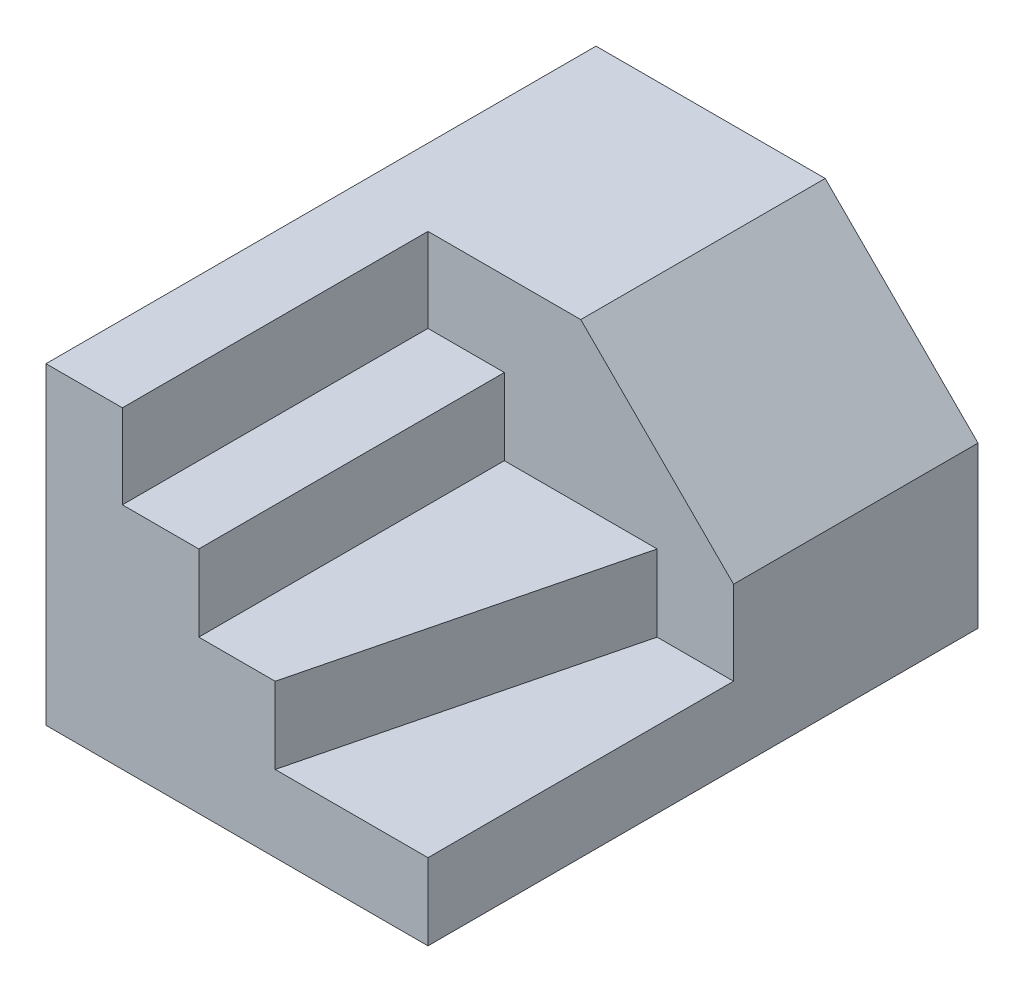
ISO-10303-21;
HEADER;
FILE_DESCRIPTION(('STEP AP214'),'2;1');
FILE_NAME('part.step','',(''),(''),'','','');
FILE_SCHEMA(('AUTOMOTIVE_DESIGN { 1 0 10303 214 1 1 1 1 }'));
ENDSEC;
DATA;
#1=APPLICATION_CONTEXT('core data for automotive mechanical design processes');
#2=APPLICATION_PROTOCOL_DEFINITION('international standard','automotive_design',2000,#1);
#3=PRODUCT_CONTEXT('',#1,'mechanical');
#4=PRODUCT('Part','Part','',(#3));
#5=PRODUCT_RELATED_PRODUCT_CATEGORY('part','',(#4));
#6=PRODUCT_DEFINITION_FORMATION('','',#4);
#7=PRODUCT_DEFINITION_CONTEXT('part definition',#1,'design');
#8=PRODUCT_DEFINITION('design','',#6,#7);
#9=PRODUCT_DEFINITION_SHAPE('','',#8);
#10=(LENGTH_UNIT() NAMED_UNIT(*) SI_UNIT(.MILLI.,.METRE.));
#11=(NAMED_UNIT(*) PLANE_ANGLE_UNIT() SI_UNIT($,.RADIAN.));
#12=(NAMED_UNIT(*) SI_UNIT($,.STERADIAN.) SOLID_ANGLE_UNIT());
#13=UNCERTAINTY_MEASURE_WITH_UNIT(LENGTH_MEASURE(1.E-05),#10,'distance_accuracy_value','');
#14=(GEOMETRIC_REPRESENTATION_CONTEXT(3) GLOBAL_UNCERTAINTY_ASSIGNED_CONTEXT((#13)) GLOBAL_UNIT_ASSIGNED_CONTEXT((#10,
#11,#12)) REPRESENTATION_CONTEXT('',''));
#15=CARTESIAN_POINT('',(0.,0.,0.));
#16=DIRECTION('',(0.,0.,1.));
#17=DIRECTION('',(1.,0.,0.));
#18=AXIS2_PLACEMENT_3D('',#15,#16,#17);
#19=CARTESIAN_POINT('',(0.,254.,0.));
#20=DIRECTION('',(0.,-1.,0.));
#21=DIRECTION('',(0.,0.,-1.));
#22=AXIS2_PLACEMENT_3D('',#19,#20,#21);
#23=PLANE('',#22);
#24=DIRECTION('',(0.242535625036333,0.,-0.970142500145332));
#25=VECTOR('',#24,1.);
#26=CARTESIAN_POINT('',(1016.,254.,-1016.));
#27=LINE('',#26,#25);
#28=CARTESIAN_POINT('',(762.,254.,0.));
#29=VERTEX_POINT('',#28);
#30=CARTESIAN_POINT('',(1016.,254.,-1016.));
#31=VERTEX_POINT('',#30);
#32=EDGE_CURVE('E149',#29,#31,#27,.T.);
#33=ORIENTED_EDGE('',*,*,#32,.F.);
#34=DIRECTION('',(1.,0.,0.));
#35=VECTOR('',#34,1.);
#36=CARTESIAN_POINT('',(0.,254.,0.));
#37=LINE('',#36,#35);
#38=CARTESIAN_POINT('',(1270.,254.,0.));
#39=VERTEX_POINT('',#38);
#40=EDGE_CURVE('E202',#29,#39,#37,.T.);
#41=ORIENTED_EDGE('',*,*,#40,.T.);
#42=DIRECTION('',(0.,0.,-1.));
#43=VECTOR('',#42,1.);
#44=CARTESIAN_POINT('',(1270.,254.,0.));
#45=LINE('',#44,#43);
#46=CARTESIAN_POINT('',(1270.,254.,-1016.));
#47=VERTEX_POINT('',#46);
#48=EDGE_CURVE('E204',#39,#47,#45,.T.);
#49=ORIENTED_EDGE('',*,*,#48,.T.);
#50=DIRECTION('',(-1.,0.,0.));
#51=VECTOR('',#50,1.);
#52=CARTESIAN_POINT('',(0.,254.,-1016.));
#53=LINE('',#52,#51);
#54=EDGE_CURVE('E178',#47,#31,#53,.T.);
#55=ORIENTED_EDGE('',*,*,#54,.T.);
#56=EDGE_LOOP('',(#33,#41,#49,#55));
#57=FACE_BOUND('',#56,.T.);
#58=ADVANCED_FACE('F37',(#57),#23,.F.);
#59=CARTESIAN_POINT('',(0.,0.,-1016.));
#60=DIRECTION('',(0.,0.,1.));
#61=DIRECTION('',(1.,0.,0.));
#62=AXIS2_PLACEMENT_3D('',#59,#60,#61);
#63=PLANE('',#62);
#64=DIRECTION('',(-1.,0.,0.));
#65=VECTOR('',#64,1.);
#66=CARTESIAN_POINT('',(508.,508.,-1016.));
#67=LINE('',#66,#65);
#68=CARTESIAN_POINT('',(1016.,508.,-1016.));
#69=VERTEX_POINT('',#68);
#70=CARTESIAN_POINT('',(508.,508.,-1016.));
#71=VERTEX_POINT('',#70);
#72=EDGE_CURVE('E52',#69,#71,#67,.T.);
#73=ORIENTED_EDGE('',*,*,#72,.F.);
#74=DIRECTION('',(0.,-1.,0.));
#75=VECTOR('',#74,1.);
#76=CARTESIAN_POINT('',(1016.,508.,-1016.));
#77=LINE('',#76,#75);
#78=EDGE_CURVE('E57',#69,#31,#77,.T.);
#79=ORIENTED_EDGE('',*,*,#78,.T.);
#80=ORIENTED_EDGE('',*,*,#54,.F.);
#81=DIRECTION('',(0.,-1.,0.));
#82=VECTOR('',#81,1.);
#83=CARTESIAN_POINT('',(1270.,254.,-1016.));
#84=LINE('',#83,#82);
#85=CARTESIAN_POINT('',(1270.,533.399999999998,-1016.));
#86=VERTEX_POINT('',#85);
#87=EDGE_CURVE('E186',#86,#47,#84,.T.);
#88=ORIENTED_EDGE('',*,*,#87,.F.);
#89=DIRECTION('',(0.707106781186546,-0.707106781186549,0.));
#90=VECTOR('',#89,1.);
#91=CARTESIAN_POINT('',(1270.,533.399999999998,-1016.));
#92=LINE('',#91,#90);
#93=CARTESIAN_POINT('',(762.,1041.4,-1016.));
#94=VERTEX_POINT('',#93);
#95=EDGE_CURVE('E183',#94,#86,#92,.T.);
#96=ORIENTED_EDGE('',*,*,#95,.F.);
#97=DIRECTION('',(1.,0.,0.));
#98=VECTOR('',#97,1.);
#99=CARTESIAN_POINT('',(762.,1041.4,-1016.));
#100=LINE('',#99,#98);
#101=CARTESIAN_POINT('',(254.,1041.4,-1016.));
#102=VERTEX_POINT('',#101);
#103=EDGE_CURVE('E180',#102,#94,#100,.T.);
#104=ORIENTED_EDGE('',*,*,#103,.F.);
#105=DIRECTION('',(0.,-1.,0.));
#106=VECTOR('',#105,1.);
#107=CARTESIAN_POINT('',(254.,1041.4,-1016.));
#108=LINE('',#107,#106);
#109=CARTESIAN_POINT('',(254.,762.,-1016.));
#110=VERTEX_POINT('',#109);
#111=EDGE_CURVE('E172',#102,#110,#108,.T.);
#112=ORIENTED_EDGE('',*,*,#111,.T.);
#113=DIRECTION('',(-1.,0.,0.));
#114=VECTOR('',#113,1.);
#115=CARTESIAN_POINT('',(508.,762.,-1016.));
#116=LINE('',#115,#114);
#117=CARTESIAN_POINT('',(508.,762.,-1016.));
#118=VERTEX_POINT('',#117);
#119=EDGE_CURVE('E164',#118,#110,#116,.T.);
#120=ORIENTED_EDGE('',*,*,#119,.F.);
#121=DIRECTION('',(0.,1.,0.));
#122=VECTOR('',#121,1.);
#123=CARTESIAN_POINT('',(508.,254.,-1016.));
#124=LINE('',#123,#122);
#125=EDGE_CURVE('E135',#71,#118,#124,.T.);
#126=ORIENTED_EDGE('',*,*,#125,.F.);
#127=EDGE_LOOP('',(#73,#79,#80,#88,#96,#104,#112,#120,#126));
#128=FACE_BOUND('',#127,.T.);
#129=ADVANCED_FACE('F259',(#128),#63,.T.);
#130=CARTESIAN_POINT('',(508.,0.,0.));
#131=DIRECTION('',(-1.,0.,0.));
#132=DIRECTION('',(0.,0.,1.));
#133=AXIS2_PLACEMENT_3D('',#130,#131,#132);
#134=PLANE('',#133);
#135=DIRECTION('',(0.,0.,1.));
#136=VECTOR('',#135,1.);
#137=CARTESIAN_POINT('',(508.,508.,0.));
#138=LINE('',#137,#136);
#139=CARTESIAN_POINT('',(508.,508.,0.));
#140=VERTEX_POINT('',#139);
#141=EDGE_CURVE('E129',#71,#140,#138,.T.);
#142=ORIENTED_EDGE('',*,*,#141,.F.);
#143=ORIENTED_EDGE('',*,*,#125,.T.);
#144=DIRECTION('',(0.,0.,1.));
#145=VECTOR('',#144,1.);
#146=CARTESIAN_POINT('',(508.,762.,0.));
#147=LINE('',#146,#145);
#148=CARTESIAN_POINT('',(508.,762.,0.));
#149=VERTEX_POINT('',#148);
#150=EDGE_CURVE('E131',#118,#149,#147,.T.);
#151=ORIENTED_EDGE('',*,*,#150,.T.);
#152=DIRECTION('',(0.,-1.,0.));
#153=VECTOR('',#152,1.);
#154=CARTESIAN_POINT('',(508.,254.,0.));
#155=LINE('',#154,#153);
#156=EDGE_CURVE('E125',#149,#140,#155,.T.);
#157=ORIENTED_EDGE('',*,*,#156,.T.);
#158=EDGE_LOOP('',(#142,#143,#151,#157));
#159=FACE_BOUND('',#158,.T.);
#160=ADVANCED_FACE('F127',(#159),#134,.F.);
#161=CARTESIAN_POINT('',(254.,1041.4,0.));
#162=DIRECTION('',(-1.,0.,0.));
#163=DIRECTION('',(0.,0.,1.));
#164=AXIS2_PLACEMENT_3D('',#161,#162,#163);
#165=PLANE('',#164);
#166=DIRECTION('',(0.,0.,1.));
#167=VECTOR('',#166,1.);
#168=CARTESIAN_POINT('',(254.,762.,0.));
#169=LINE('',#168,#167);
#170=CARTESIAN_POINT('',(254.,762.,0.));
#171=VERTEX_POINT('',#170);
#172=EDGE_CURVE('E136',#110,#171,#169,.T.);
#173=ORIENTED_EDGE('',*,*,#172,.F.);
#174=ORIENTED_EDGE('',*,*,#111,.F.);
#175=DIRECTION('',(0.,0.,-1.));
#176=VECTOR('',#175,1.);
#177=CARTESIAN_POINT('',(254.,1041.4,0.));
#178=LINE('',#177,#176);
#179=CARTESIAN_POINT('',(254.,1041.4,0.));
#180=VERTEX_POINT('',#179);
#181=EDGE_CURVE('E169',#180,#102,#178,.T.);
#182=ORIENTED_EDGE('',*,*,#181,.F.);
#183=DIRECTION('',(0.,-1.,0.));
#184=VECTOR('',#183,1.);
#185=CARTESIAN_POINT('',(254.,1041.4,0.));
#186=LINE('',#185,#184);
#187=EDGE_CURVE('E175',#180,#171,#186,.T.);
#188=ORIENTED_EDGE('',*,*,#187,.T.);
#189=EDGE_LOOP('',(#173,#174,#182,#188));
#190=FACE_BOUND('',#189,.T.);
#191=ADVANCED_FACE('F279',(#190),#165,.F.);
#192=CARTESIAN_POINT('',(0.,254.,0.));
#193=DIRECTION('',(1.,0.,0.));
#194=DIRECTION('',(0.,0.,-1.));
#195=AXIS2_PLACEMENT_3D('',#192,#193,#194);
#196=PLANE('',#195);
#197=DIRECTION('',(0.,-1.,0.));
#198=VECTOR('',#197,1.);
#199=CARTESIAN_POINT('',(0.,254.,0.));
#200=LINE('',#199,#198);
#201=CARTESIAN_POINT('',(0.,1041.4,0.));
#202=VERTEX_POINT('',#201);
#203=CARTESIAN_POINT('',(0.,0.,0.));
#204=VERTEX_POINT('',#203);
#205=EDGE_CURVE('E11',#202,#204,#200,.T.);
#206=ORIENTED_EDGE('',*,*,#205,.F.);
#207=DIRECTION('',(0.,0.,-1.));
#208=VECTOR('',#207,1.);
#209=CARTESIAN_POINT('',(0.,1041.4,-1016.));
#210=LINE('',#209,#208);
#211=CARTESIAN_POINT('',(0.,1041.4,-1828.8));
#212=VERTEX_POINT('',#211);
#213=EDGE_CURVE('E189',#202,#212,#210,.T.);
#214=ORIENTED_EDGE('',*,*,#213,.T.);
#215=DIRECTION('',(0.,-1.,0.));
#216=VECTOR('',#215,1.);
#217=CARTESIAN_POINT('',(0.,254.,-1828.8));
#218=LINE('',#217,#216);
#219=CARTESIAN_POINT('',(0.,0.,-1828.8));
#220=VERTEX_POINT('',#219);
#221=EDGE_CURVE('E208',#212,#220,#218,.T.);
#222=ORIENTED_EDGE('',*,*,#221,.T.);
#223=DIRECTION('',(0.,0.,1.));
#224=VECTOR('',#223,1.);
#225=CARTESIAN_POINT('',(0.,0.,0.));
#226=LINE('',#225,#224);
#227=EDGE_CURVE('E197',#220,#204,#226,.T.);
#228=ORIENTED_EDGE('',*,*,#227,.T.);
#229=EDGE_LOOP('',(#206,#214,#222,#228));
#230=FACE_BOUND('',#229,.T.);
#231=ADVANCED_FACE('F39',(#230),#196,.F.);
#232=CARTESIAN_POINT('',(0.,254.,0.));
#233=DIRECTION('',(0.,0.,-1.));
#234=DIRECTION('',(-1.,0.,0.));
#235=AXIS2_PLACEMENT_3D('',#232,#233,#234);
#236=PLANE('',#235);
#237=ORIENTED_EDGE('',*,*,#40,.F.);
#238=DIRECTION('',(0.,-1.,0.));
#239=VECTOR('',#238,1.);
#240=CARTESIAN_POINT('',(762.,508.,0.));
#241=LINE('',#240,#239);
#242=CARTESIAN_POINT('',(762.,508.,0.));
#243=VERTEX_POINT('',#242);
#244=EDGE_CURVE('E143',#243,#29,#241,.T.);
#245=ORIENTED_EDGE('',*,*,#244,.F.);
#246=DIRECTION('',(1.,0.,0.));
#247=VECTOR('',#246,1.);
#248=CARTESIAN_POINT('',(762.,508.,0.));
#249=LINE('',#248,#247);
#250=EDGE_CURVE('E139',#140,#243,#249,.T.);
#251=ORIENTED_EDGE('',*,*,#250,.F.);
#252=ORIENTED_EDGE('',*,*,#156,.F.);
#253=DIRECTION('',(-1.,0.,0.));
#254=VECTOR('',#253,1.);
#255=CARTESIAN_POINT('',(508.,762.,0.));
#256=LINE('',#255,#254);
#257=EDGE_CURVE('E160',#149,#171,#256,.T.);
#258=ORIENTED_EDGE('',*,*,#257,.T.);
#259=ORIENTED_EDGE('',*,*,#187,.F.);
#260=DIRECTION('',(1.,0.,0.));
#261=VECTOR('',#260,1.);
#262=CARTESIAN_POINT('',(0.,1041.4,0.));
#263=LINE('',#262,#261);
#264=EDGE_CURVE('E167',#202,#180,#263,.T.);
#265=ORIENTED_EDGE('',*,*,#264,.F.);
#266=ORIENTED_EDGE('',*,*,#205,.T.);
#267=DIRECTION('',(1.,0.,0.));
#268=VECTOR('',#267,1.);
#269=CARTESIAN_POINT('',(0.,0.,0.));
#270=LINE('',#269,#268);
#271=CARTESIAN_POINT('',(1270.,0.,0.));
#272=VERTEX_POINT('',#271);
#273=EDGE_CURVE('E211',#204,#272,#270,.T.);
#274=ORIENTED_EDGE('',*,*,#273,.T.);
#275=DIRECTION('',(0.,-1.,0.));
#276=VECTOR('',#275,1.);
#277=CARTESIAN_POINT('',(1270.,254.,0.));
#278=LINE('',#277,#276);
#279=EDGE_CURVE('E45',#39,#272,#278,.T.);
#280=ORIENTED_EDGE('',*,*,#279,.F.);
#281=EDGE_LOOP('',(#237,#245,#251,#252,#258,#259,#265,#266,#274,#280));
#282=FACE_BOUND('',#281,.T.);
#283=ADVANCED_FACE('F141',(#282),#236,.F.);
#284=CARTESIAN_POINT('',(1270.,254.,0.));
#285=DIRECTION('',(-1.,0.,0.));
#286=DIRECTION('',(0.,0.,1.));
#287=AXIS2_PLACEMENT_3D('',#284,#285,#286);
#288=PLANE('',#287);
#289=DIRECTION('',(0.,0.,-1.));
#290=VECTOR('',#289,1.);
#291=CARTESIAN_POINT('',(1270.,0.,0.));
#292=LINE('',#291,#290);
#293=CARTESIAN_POINT('',(1270.,0.,-1828.8));
#294=VERTEX_POINT('',#293);
#295=EDGE_CURVE('E213',#272,#294,#292,.T.);
#296=ORIENTED_EDGE('',*,*,#295,.T.);
#297=DIRECTION('',(0.,-1.,0.));
#298=VECTOR('',#297,1.);
#299=CARTESIAN_POINT('',(1270.,254.,-1828.8));
#300=LINE('',#299,#298);
#301=CARTESIAN_POINT('',(1270.,533.399999999998,-1828.8));
#302=VERTEX_POINT('',#301);
#303=EDGE_CURVE('E218',#302,#294,#300,.T.);
#304=ORIENTED_EDGE('',*,*,#303,.F.);
#305=DIRECTION('',(0.,0.,-1.));
#306=VECTOR('',#305,1.);
#307=CARTESIAN_POINT('',(1270.,533.399999999998,-1016.));
#308=LINE('',#307,#306);
#309=EDGE_CURVE('E194',#86,#302,#308,.T.);
#310=ORIENTED_EDGE('',*,*,#309,.F.);
#311=ORIENTED_EDGE('',*,*,#87,.T.);
#312=ORIENTED_EDGE('',*,*,#48,.F.);
#313=ORIENTED_EDGE('',*,*,#279,.T.);
#314=EDGE_LOOP('',(#296,#304,#310,#311,#312,#313));
#315=FACE_BOUND('',#314,.T.);
#316=ADVANCED_FACE('F225',(#315),#288,.F.);
#317=CARTESIAN_POINT('',(0.,254.,-1828.8));
#318=DIRECTION('',(0.,0.,1.));
#319=DIRECTION('',(1.,0.,0.));
#320=AXIS2_PLACEMENT_3D('',#317,#318,#319);
#321=PLANE('',#320);
#322=DIRECTION('',(-1.,0.,0.));
#323=VECTOR('',#322,1.);
#324=CARTESIAN_POINT('',(0.,0.,-1828.8));
#325=LINE('',#324,#323);
#326=EDGE_CURVE('E205',#294,#220,#325,.T.);
#327=ORIENTED_EDGE('',*,*,#326,.T.);
#328=ORIENTED_EDGE('',*,*,#221,.F.);
#329=DIRECTION('',(1.,0.,0.));
#330=VECTOR('',#329,1.);
#331=CARTESIAN_POINT('',(762.,1041.4,-1828.8));
#332=LINE('',#331,#330);
#333=CARTESIAN_POINT('',(762.,1041.4,-1828.8));
#334=VERTEX_POINT('',#333);
#335=EDGE_CURVE('E177',#212,#334,#332,.T.);
#336=ORIENTED_EDGE('',*,*,#335,.T.);
#337=DIRECTION('',(0.707106781186546,-0.707106781186549,0.));
#338=VECTOR('',#337,1.);
#339=CARTESIAN_POINT('',(1270.,533.399999999998,-1828.8));
#340=LINE('',#339,#338);
#341=EDGE_CURVE('E181',#334,#302,#340,.T.);
#342=ORIENTED_EDGE('',*,*,#341,.T.);
#343=ORIENTED_EDGE('',*,*,#303,.T.);
#344=EDGE_LOOP('',(#327,#328,#336,#342,#343));
#345=FACE_BOUND('',#344,.T.);
#346=ADVANCED_FACE('F231',(#345),#321,.F.);
#347=CARTESIAN_POINT('',(0.,0.,0.));
#348=DIRECTION('',(0.,-1.,0.));
#349=DIRECTION('',(0.,0.,-1.));
#350=AXIS2_PLACEMENT_3D('',#347,#348,#349);
#351=PLANE('',#350);
#352=ORIENTED_EDGE('',*,*,#227,.F.);
#353=ORIENTED_EDGE('',*,*,#326,.F.);
#354=ORIENTED_EDGE('',*,*,#295,.F.);
#355=ORIENTED_EDGE('',*,*,#273,.F.);
#356=EDGE_LOOP('',(#352,#353,#354,#355));
#357=FACE_BOUND('',#356,.T.);
#358=ADVANCED_FACE('F229',(#357),#351,.T.);
#359=CARTESIAN_POINT('',(1270.,533.399999999998,-1016.));
#360=DIRECTION('',(0.707106781186549,0.707106781186546,0.));
#361=DIRECTION('',(-0.707106781186546,0.707106781186549,0.));
#362=AXIS2_PLACEMENT_3D('',#359,#360,#361);
#363=PLANE('',#362);
#364=ORIENTED_EDGE('',*,*,#341,.F.);
#365=DIRECTION('',(0.,0.,-1.));
#366=VECTOR('',#365,1.);
#367=CARTESIAN_POINT('',(762.,1041.4,-1016.));
#368=LINE('',#367,#366);
#369=EDGE_CURVE('E198',#94,#334,#368,.T.);
#370=ORIENTED_EDGE('',*,*,#369,.F.);
#371=ORIENTED_EDGE('',*,*,#95,.T.);
#372=ORIENTED_EDGE('',*,*,#309,.T.);
#373=EDGE_LOOP('',(#364,#370,#371,#372));
#374=FACE_BOUND('',#373,.T.);
#375=ADVANCED_FACE('F241',(#374),#363,.T.);
#376=CARTESIAN_POINT('',(762.,1041.4,-1016.));
#377=DIRECTION('',(0.,1.,0.));
#378=DIRECTION('',(0.,0.,1.));
#379=AXIS2_PLACEMENT_3D('',#376,#377,#378);
#380=PLANE('',#379);
#381=ORIENTED_EDGE('',*,*,#335,.F.);
#382=ORIENTED_EDGE('',*,*,#213,.F.);
#383=ORIENTED_EDGE('',*,*,#264,.T.);
#384=ORIENTED_EDGE('',*,*,#181,.T.);
#385=ORIENTED_EDGE('',*,*,#103,.T.);
#386=ORIENTED_EDGE('',*,*,#369,.T.);
#387=EDGE_LOOP('',(#381,#382,#383,#384,#385,#386));
#388=FACE_BOUND('',#387,.T.);
#389=ADVANCED_FACE('F237',(#388),#380,.T.);
#390=CARTESIAN_POINT('',(508.,762.,0.));
#391=DIRECTION('',(0.,-1.,0.));
#392=DIRECTION('',(0.,0.,-1.));
#393=AXIS2_PLACEMENT_3D('',#390,#391,#392);
#394=PLANE('',#393);
#395=ORIENTED_EDGE('',*,*,#172,.T.);
#396=ORIENTED_EDGE('',*,*,#257,.F.);
#397=ORIENTED_EDGE('',*,*,#150,.F.);
#398=ORIENTED_EDGE('',*,*,#119,.T.);
#399=EDGE_LOOP('',(#395,#396,#397,#398));
#400=FACE_BOUND('',#399,.T.);
#401=ADVANCED_FACE('F248',(#400),#394,.F.);
#402=CARTESIAN_POINT('',(1016.,508.,-1016.));
#403=DIRECTION('',(-0.970142500145332,0.,-0.242535625036333));
#404=DIRECTION('',(-0.242535625036333,0.,0.970142500145332));
#405=AXIS2_PLACEMENT_3D('',#402,#403,#404);
#406=PLANE('',#405);
#407=ORIENTED_EDGE('',*,*,#32,.T.);
#408=ORIENTED_EDGE('',*,*,#78,.F.);
#409=DIRECTION('',(0.242535625036333,0.,-0.970142500145332));
#410=VECTOR('',#409,1.);
#411=CARTESIAN_POINT('',(1016.,508.,-1016.));
#412=LINE('',#411,#410);
#413=EDGE_CURVE('E146',#243,#69,#412,.T.);
#414=ORIENTED_EDGE('',*,*,#413,.F.);
#415=ORIENTED_EDGE('',*,*,#244,.T.);
#416=EDGE_LOOP('',(#407,#408,#414,#415));
#417=FACE_BOUND('',#416,.T.);
#418=ADVANCED_FACE('F246',(#417),#406,.F.);
#419=CARTESIAN_POINT('',(0.,508.,0.));
#420=DIRECTION('',(0.,-1.,0.));
#421=DIRECTION('',(0.,0.,-1.));
#422=AXIS2_PLACEMENT_3D('',#419,#420,#421);
#423=PLANE('',#422);
#424=ORIENTED_EDGE('',*,*,#141,.T.);
#425=ORIENTED_EDGE('',*,*,#250,.T.);
#426=ORIENTED_EDGE('',*,*,#413,.T.);
#427=ORIENTED_EDGE('',*,*,#72,.T.);
#428=EDGE_LOOP('',(#424,#425,#426,#427));
#429=FACE_BOUND('',#428,.T.);
#430=ADVANCED_FACE('F148',(#429),#423,.F.);
#431=CLOSED_SHELL('',(#58,#129,#160,#191,#231,#283,#316,#346,#358,#375,#389,#401,#418,#430));
#432=MANIFOLD_SOLID_BREP('B2',#431);
#433=ADVANCED_BREP_SHAPE_REPRESENTATION('',(#18,#432),#14);
#434=SHAPE_DEFINITION_REPRESENTATION(#9,#433);
ENDSEC;
END-ISO-10303-21;
